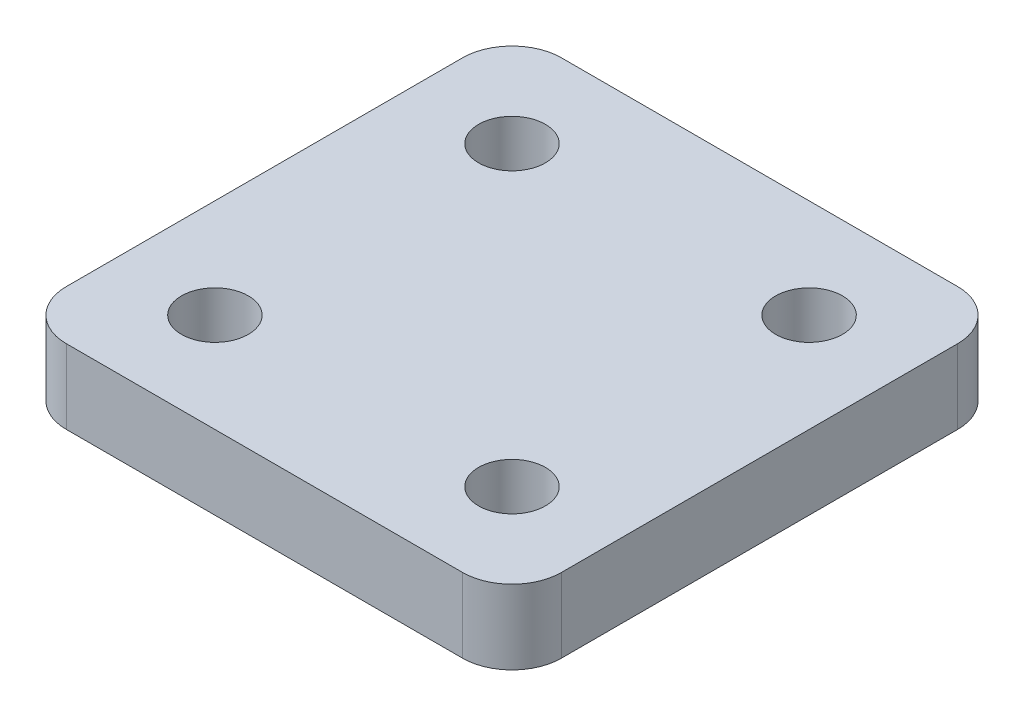
ISO-10303-21;
HEADER;
FILE_DESCRIPTION(('STEP AP214'),'2;1');
FILE_NAME('part.step','',(''),(''),'','','');
FILE_SCHEMA(('AUTOMOTIVE_DESIGN { 1 0 10303 214 1 1 1 1 }'));
ENDSEC;
DATA;
#1=APPLICATION_CONTEXT('core data for automotive mechanical design processes');
#2=APPLICATION_PROTOCOL_DEFINITION('international standard','automotive_design',2000,#1);
#3=PRODUCT_CONTEXT('',#1,'mechanical');
#4=PRODUCT('Part','Part','',(#3));
#5=PRODUCT_RELATED_PRODUCT_CATEGORY('part','',(#4));
#6=PRODUCT_DEFINITION_FORMATION('','',#4);
#7=PRODUCT_DEFINITION_CONTEXT('part definition',#1,'design');
#8=PRODUCT_DEFINITION('design','',#6,#7);
#9=PRODUCT_DEFINITION_SHAPE('','',#8);
#10=(LENGTH_UNIT() NAMED_UNIT(*) SI_UNIT(.MILLI.,.METRE.));
#11=(NAMED_UNIT(*) PLANE_ANGLE_UNIT() SI_UNIT($,.RADIAN.));
#12=(NAMED_UNIT(*) SI_UNIT($,.STERADIAN.) SOLID_ANGLE_UNIT());
#13=UNCERTAINTY_MEASURE_WITH_UNIT(LENGTH_MEASURE(1.E-05),#10,'distance_accuracy_value','');
#14=(GEOMETRIC_REPRESENTATION_CONTEXT(3) GLOBAL_UNCERTAINTY_ASSIGNED_CONTEXT((#13)) GLOBAL_UNIT_ASSIGNED_CONTEXT((#10,
#11,#12)) REPRESENTATION_CONTEXT('',''));
#15=CARTESIAN_POINT('',(0.,0.,0.));
#16=DIRECTION('',(0.,0.,1.));
#17=DIRECTION('',(1.,0.,0.));
#18=AXIS2_PLACEMENT_3D('',#15,#16,#17);
#19=CARTESIAN_POINT('',(0.,3.,0.));
#20=DIRECTION('',(0.,-1.,0.));
#21=DIRECTION('',(0.,0.,-1.));
#22=AXIS2_PLACEMENT_3D('',#19,#20,#21);
#23=PLANE('',#22);
#24=DIRECTION('',(0.,0.,1.));
#25=VECTOR('',#24,1.);
#26=CARTESIAN_POINT('',(-10.,3.,10.));
#27=LINE('',#26,#25);
#28=CARTESIAN_POINT('',(-9.99999999999999,3.,-8.));
#29=VERTEX_POINT('',#28);
#30=CARTESIAN_POINT('',(-10.,3.,8.));
#31=VERTEX_POINT('',#30);
#32=EDGE_CURVE('E214',#29,#31,#27,.T.);
#33=ORIENTED_EDGE('',*,*,#32,.T.);
#34=CARTESIAN_POINT('',(-8.,3.,8.));
#35=DIRECTION('',(0.,-1.,0.));
#36=DIRECTION('',(0.,0.,-1.));
#37=AXIS2_PLACEMENT_3D('',#34,#35,#36);
#38=CIRCLE('',#37,2.);
#39=CARTESIAN_POINT('',(-8.,3.,10.));
#40=VERTEX_POINT('',#39);
#41=EDGE_CURVE('E166',#31,#40,#38,.F.);
#42=ORIENTED_EDGE('',*,*,#41,.T.);
#43=DIRECTION('',(1.,0.,0.));
#44=VECTOR('',#43,1.);
#45=CARTESIAN_POINT('',(-10.,3.,10.));
#46=LINE('',#45,#44);
#47=CARTESIAN_POINT('',(8.00000000000001,3.,10.));
#48=VERTEX_POINT('',#47);
#49=EDGE_CURVE('E125',#40,#48,#46,.T.);
#50=ORIENTED_EDGE('',*,*,#49,.T.);
#51=CARTESIAN_POINT('',(8.,3.,8.));
#52=DIRECTION('',(0.,-1.,0.));
#53=DIRECTION('',(0.,0.,-1.));
#54=AXIS2_PLACEMENT_3D('',#51,#52,#53);
#55=CIRCLE('',#54,2.);
#56=CARTESIAN_POINT('',(10.,3.,8.));
#57=VERTEX_POINT('',#56);
#58=EDGE_CURVE('E161',#48,#57,#55,.F.);
#59=ORIENTED_EDGE('',*,*,#58,.T.);
#60=DIRECTION('',(0.,0.,-1.));
#61=VECTOR('',#60,1.);
#62=CARTESIAN_POINT('',(10.,3.,10.));
#63=LINE('',#62,#61);
#64=CARTESIAN_POINT('',(10.,3.,-8.));
#65=VERTEX_POINT('',#64);
#66=EDGE_CURVE('E133',#57,#65,#63,.T.);
#67=ORIENTED_EDGE('',*,*,#66,.T.);
#68=CARTESIAN_POINT('',(8.,3.,-8.00000000000001));
#69=DIRECTION('',(0.,-1.,0.));
#70=DIRECTION('',(0.,0.,-1.));
#71=AXIS2_PLACEMENT_3D('',#68,#69,#70);
#72=CIRCLE('',#71,2.);
#73=CARTESIAN_POINT('',(8.,3.,-10.));
#74=VERTEX_POINT('',#73);
#75=EDGE_CURVE('E60',#65,#74,#72,.F.);
#76=ORIENTED_EDGE('',*,*,#75,.T.);
#77=DIRECTION('',(-1.,0.,0.));
#78=VECTOR('',#77,1.);
#79=CARTESIAN_POINT('',(-9.99999999999999,3.,-10.));
#80=LINE('',#79,#78);
#81=CARTESIAN_POINT('',(-7.99999999999999,3.,-10.));
#82=VERTEX_POINT('',#81);
#83=EDGE_CURVE('E137',#74,#82,#80,.T.);
#84=ORIENTED_EDGE('',*,*,#83,.T.);
#85=CARTESIAN_POINT('',(-7.99999999999999,3.,-8.));
#86=DIRECTION('',(0.,-1.,0.));
#87=DIRECTION('',(0.,0.,-1.));
#88=AXIS2_PLACEMENT_3D('',#85,#86,#87);
#89=CIRCLE('',#88,2.);
#90=EDGE_CURVE('E164',#82,#29,#89,.F.);
#91=ORIENTED_EDGE('',*,*,#90,.T.);
#92=EDGE_LOOP('',(#33,#42,#50,#59,#67,#76,#84,#91));
#93=FACE_BOUND('',#92,.T.);
#94=CARTESIAN_POINT('',(-6.,3.,-6.));
#95=DIRECTION('',(0.,1.,0.));
#96=DIRECTION('',(0.,0.,1.));
#97=AXIS2_PLACEMENT_3D('',#94,#95,#96);
#98=CIRCLE('',#97,1.35);
#99=CARTESIAN_POINT('',(-6.,3.,-4.65));
#100=VERTEX_POINT('',#99);
#101=EDGE_CURVE('E184',#100,#100,#98,.T.);
#102=ORIENTED_EDGE('',*,*,#101,.F.);
#103=EDGE_LOOP('',(#102));
#104=FACE_BOUND('',#103,.T.);
#105=CARTESIAN_POINT('',(6.,3.,-6.));
#106=DIRECTION('',(0.,1.,0.));
#107=DIRECTION('',(0.,0.,-1.));
#108=AXIS2_PLACEMENT_3D('',#105,#106,#107);
#109=CIRCLE('',#108,1.35);
#110=CARTESIAN_POINT('',(6.,3.,-7.35));
#111=VERTEX_POINT('',#110);
#112=EDGE_CURVE('E220',#111,#111,#109,.T.);
#113=ORIENTED_EDGE('',*,*,#112,.F.);
#114=EDGE_LOOP('',(#113));
#115=FACE_BOUND('',#114,.T.);
#116=CARTESIAN_POINT('',(6.,3.,6.));
#117=DIRECTION('',(0.,1.,0.));
#118=DIRECTION('',(0.,0.,1.));
#119=AXIS2_PLACEMENT_3D('',#116,#117,#118);
#120=CIRCLE('',#119,1.35);
#121=CARTESIAN_POINT('',(6.,3.,7.35));
#122=VERTEX_POINT('',#121);
#123=EDGE_CURVE('E226',#122,#122,#120,.T.);
#124=ORIENTED_EDGE('',*,*,#123,.F.);
#125=EDGE_LOOP('',(#124));
#126=FACE_BOUND('',#125,.T.);
#127=CARTESIAN_POINT('',(-6.,3.,6.));
#128=DIRECTION('',(0.,1.,0.));
#129=DIRECTION('',(0.,0.,-1.));
#130=AXIS2_PLACEMENT_3D('',#127,#128,#129);
#131=CIRCLE('',#130,1.35);
#132=CARTESIAN_POINT('',(-6.,3.,4.65));
#133=VERTEX_POINT('',#132);
#134=EDGE_CURVE('E234',#133,#133,#131,.T.);
#135=ORIENTED_EDGE('',*,*,#134,.F.);
#136=EDGE_LOOP('',(#135));
#137=FACE_BOUND('',#136,.T.);
#138=ADVANCED_FACE('F38',(#93,#104,#115,#126,#137),#23,.F.);
#139=CARTESIAN_POINT('',(0.,0.,0.));
#140=DIRECTION('',(0.,-1.,0.));
#141=DIRECTION('',(0.,0.,-1.));
#142=AXIS2_PLACEMENT_3D('',#139,#140,#141);
#143=PLANE('',#142);
#144=CARTESIAN_POINT('',(6.,0.,6.));
#145=DIRECTION('',(0.,1.,0.));
#146=DIRECTION('',(0.,0.,1.));
#147=AXIS2_PLACEMENT_3D('',#144,#145,#146);
#148=CIRCLE('',#147,1.35);
#149=CARTESIAN_POINT('',(6.,0.,7.35));
#150=VERTEX_POINT('',#149);
#151=EDGE_CURVE('E229',#150,#150,#148,.T.);
#152=ORIENTED_EDGE('',*,*,#151,.T.);
#153=EDGE_LOOP('',(#152));
#154=FACE_BOUND('',#153,.T.);
#155=CARTESIAN_POINT('',(-6.,0.,-6.));
#156=DIRECTION('',(0.,1.,0.));
#157=DIRECTION('',(0.,0.,1.));
#158=AXIS2_PLACEMENT_3D('',#155,#156,#157);
#159=CIRCLE('',#158,1.35);
#160=CARTESIAN_POINT('',(-6.,0.,-4.65));
#161=VERTEX_POINT('',#160);
#162=EDGE_CURVE('E190',#161,#161,#159,.T.);
#163=ORIENTED_EDGE('',*,*,#162,.T.);
#164=EDGE_LOOP('',(#163));
#165=FACE_BOUND('',#164,.T.);
#166=DIRECTION('',(1.,0.,0.));
#167=VECTOR('',#166,1.);
#168=CARTESIAN_POINT('',(-10.,0.,10.));
#169=LINE('',#168,#167);
#170=CARTESIAN_POINT('',(-8.,0.,10.));
#171=VERTEX_POINT('',#170);
#172=CARTESIAN_POINT('',(8.00000000000001,0.,10.));
#173=VERTEX_POINT('',#172);
#174=EDGE_CURVE('E122',#171,#173,#169,.T.);
#175=ORIENTED_EDGE('',*,*,#174,.F.);
#176=CARTESIAN_POINT('',(-8.,0.,8.));
#177=DIRECTION('',(0.,-1.,0.));
#178=DIRECTION('',(0.,0.,-1.));
#179=AXIS2_PLACEMENT_3D('',#176,#177,#178);
#180=CIRCLE('',#179,2.);
#181=CARTESIAN_POINT('',(-10.,0.,8.));
#182=VERTEX_POINT('',#181);
#183=EDGE_CURVE('E104',#171,#182,#180,.T.);
#184=ORIENTED_EDGE('',*,*,#183,.T.);
#185=DIRECTION('',(0.,0.,1.));
#186=VECTOR('',#185,1.);
#187=CARTESIAN_POINT('',(-10.,0.,10.));
#188=LINE('',#187,#186);
#189=CARTESIAN_POINT('',(-9.99999999999999,0.,-8.));
#190=VERTEX_POINT('',#189);
#191=EDGE_CURVE('E134',#190,#182,#188,.T.);
#192=ORIENTED_EDGE('',*,*,#191,.F.);
#193=CARTESIAN_POINT('',(-7.99999999999999,0.,-8.));
#194=DIRECTION('',(0.,-1.,0.));
#195=DIRECTION('',(0.,0.,-1.));
#196=AXIS2_PLACEMENT_3D('',#193,#194,#195);
#197=CIRCLE('',#196,2.);
#198=CARTESIAN_POINT('',(-7.99999999999999,0.,-10.));
#199=VERTEX_POINT('',#198);
#200=EDGE_CURVE('E116',#190,#199,#197,.T.);
#201=ORIENTED_EDGE('',*,*,#200,.T.);
#202=DIRECTION('',(-1.,0.,0.));
#203=VECTOR('',#202,1.);
#204=CARTESIAN_POINT('',(-9.99999999999999,0.,-10.));
#205=LINE('',#204,#203);
#206=CARTESIAN_POINT('',(8.,0.,-10.));
#207=VERTEX_POINT('',#206);
#208=EDGE_CURVE('E140',#207,#199,#205,.T.);
#209=ORIENTED_EDGE('',*,*,#208,.F.);
#210=CARTESIAN_POINT('',(8.,0.,-8.00000000000001));
#211=DIRECTION('',(0.,-1.,0.));
#212=DIRECTION('',(0.,0.,-1.));
#213=AXIS2_PLACEMENT_3D('',#210,#211,#212);
#214=CIRCLE('',#213,2.);
#215=CARTESIAN_POINT('',(10.,0.,-8.));
#216=VERTEX_POINT('',#215);
#217=EDGE_CURVE('E182',#207,#216,#214,.T.);
#218=ORIENTED_EDGE('',*,*,#217,.T.);
#219=DIRECTION('',(0.,0.,-1.));
#220=VECTOR('',#219,1.);
#221=CARTESIAN_POINT('',(10.,0.,10.));
#222=LINE('',#221,#220);
#223=CARTESIAN_POINT('',(10.,0.,8.));
#224=VERTEX_POINT('',#223);
#225=EDGE_CURVE('E177',#224,#216,#222,.T.);
#226=ORIENTED_EDGE('',*,*,#225,.F.);
#227=CARTESIAN_POINT('',(8.,0.,8.));
#228=DIRECTION('',(0.,-1.,0.));
#229=DIRECTION('',(0.,0.,-1.));
#230=AXIS2_PLACEMENT_3D('',#227,#228,#229);
#231=CIRCLE('',#230,2.);
#232=EDGE_CURVE('E126',#224,#173,#231,.T.);
#233=ORIENTED_EDGE('',*,*,#232,.T.);
#234=EDGE_LOOP('',(#175,#184,#192,#201,#209,#218,#226,#233));
#235=FACE_BOUND('',#234,.T.);
#236=CARTESIAN_POINT('',(6.,0.,-6.));
#237=DIRECTION('',(0.,1.,0.));
#238=DIRECTION('',(0.,0.,-1.));
#239=AXIS2_PLACEMENT_3D('',#236,#237,#238);
#240=CIRCLE('',#239,1.35);
#241=CARTESIAN_POINT('',(6.,0.,-7.35));
#242=VERTEX_POINT('',#241);
#243=EDGE_CURVE('E221',#242,#242,#240,.T.);
#244=ORIENTED_EDGE('',*,*,#243,.T.);
#245=EDGE_LOOP('',(#244));
#246=FACE_BOUND('',#245,.T.);
#247=CARTESIAN_POINT('',(-6.,0.,6.));
#248=DIRECTION('',(0.,1.,0.));
#249=DIRECTION('',(0.,0.,-1.));
#250=AXIS2_PLACEMENT_3D('',#247,#248,#249);
#251=CIRCLE('',#250,1.35);
#252=CARTESIAN_POINT('',(-6.,0.,4.65));
#253=VERTEX_POINT('',#252);
#254=EDGE_CURVE('E236',#253,#253,#251,.T.);
#255=ORIENTED_EDGE('',*,*,#254,.T.);
#256=EDGE_LOOP('',(#255));
#257=FACE_BOUND('',#256,.T.);
#258=ADVANCED_FACE('F129',(#154,#165,#235,#246,#257),#143,.T.);
#259=CARTESIAN_POINT('',(10.,3.,10.));
#260=DIRECTION('',(-1.,0.,0.));
#261=DIRECTION('',(0.,0.,1.));
#262=AXIS2_PLACEMENT_3D('',#259,#260,#261);
#263=PLANE('',#262);
#264=ORIENTED_EDGE('',*,*,#225,.T.);
#265=DIRECTION('',(0.,-1.,0.));
#266=VECTOR('',#265,1.);
#267=CARTESIAN_POINT('',(10.,3.,-8.));
#268=LINE('',#267,#266);
#269=EDGE_CURVE('E12',#216,#65,#268,.F.);
#270=ORIENTED_EDGE('',*,*,#269,.T.);
#271=ORIENTED_EDGE('',*,*,#66,.F.);
#272=DIRECTION('',(0.,-1.,0.));
#273=VECTOR('',#272,1.);
#274=CARTESIAN_POINT('',(10.,3.,8.));
#275=LINE('',#274,#273);
#276=EDGE_CURVE('E46',#57,#224,#275,.T.);
#277=ORIENTED_EDGE('',*,*,#276,.T.);
#278=EDGE_LOOP('',(#264,#270,#271,#277));
#279=FACE_BOUND('',#278,.T.);
#280=ADVANCED_FACE('F176',(#279),#263,.F.);
#281=CARTESIAN_POINT('',(-9.99999999999999,3.,-10.));
#282=DIRECTION('',(0.,0.,1.));
#283=DIRECTION('',(1.,0.,0.));
#284=AXIS2_PLACEMENT_3D('',#281,#282,#283);
#285=PLANE('',#284);
#286=ORIENTED_EDGE('',*,*,#208,.T.);
#287=DIRECTION('',(0.,-1.,0.));
#288=VECTOR('',#287,1.);
#289=CARTESIAN_POINT('',(-7.99999999999999,3.,-10.));
#290=LINE('',#289,#288);
#291=EDGE_CURVE('E53',#199,#82,#290,.F.);
#292=ORIENTED_EDGE('',*,*,#291,.T.);
#293=ORIENTED_EDGE('',*,*,#83,.F.);
#294=DIRECTION('',(0.,-1.,0.));
#295=VECTOR('',#294,1.);
#296=CARTESIAN_POINT('',(8.,3.,-10.));
#297=LINE('',#296,#295);
#298=EDGE_CURVE('E168',#74,#207,#297,.T.);
#299=ORIENTED_EDGE('',*,*,#298,.T.);
#300=EDGE_LOOP('',(#286,#292,#293,#299));
#301=FACE_BOUND('',#300,.T.);
#302=ADVANCED_FACE('F207',(#301),#285,.F.);
#303=CARTESIAN_POINT('',(-10.,3.,10.));
#304=DIRECTION('',(1.,0.,0.));
#305=DIRECTION('',(0.,0.,-1.));
#306=AXIS2_PLACEMENT_3D('',#303,#304,#305);
#307=PLANE('',#306);
#308=ORIENTED_EDGE('',*,*,#191,.T.);
#309=DIRECTION('',(0.,-1.,0.));
#310=VECTOR('',#309,1.);
#311=CARTESIAN_POINT('',(-10.,3.,8.));
#312=LINE('',#311,#310);
#313=EDGE_CURVE('E109',#182,#31,#312,.F.);
#314=ORIENTED_EDGE('',*,*,#313,.T.);
#315=ORIENTED_EDGE('',*,*,#32,.F.);
#316=DIRECTION('',(0.,-1.,0.));
#317=VECTOR('',#316,1.);
#318=CARTESIAN_POINT('',(-9.99999999999999,3.,-8.));
#319=LINE('',#318,#317);
#320=EDGE_CURVE('E115',#29,#190,#319,.T.);
#321=ORIENTED_EDGE('',*,*,#320,.T.);
#322=EDGE_LOOP('',(#308,#314,#315,#321));
#323=FACE_BOUND('',#322,.T.);
#324=ADVANCED_FACE('F216',(#323),#307,.F.);
#325=CARTESIAN_POINT('',(-10.,3.,10.));
#326=DIRECTION('',(0.,0.,-1.));
#327=DIRECTION('',(-1.,0.,0.));
#328=AXIS2_PLACEMENT_3D('',#325,#326,#327);
#329=PLANE('',#328);
#330=ORIENTED_EDGE('',*,*,#49,.F.);
#331=DIRECTION('',(0.,-1.,0.));
#332=VECTOR('',#331,1.);
#333=CARTESIAN_POINT('',(-8.,3.,10.));
#334=LINE('',#333,#332);
#335=EDGE_CURVE('E108',#40,#171,#334,.T.);
#336=ORIENTED_EDGE('',*,*,#335,.T.);
#337=ORIENTED_EDGE('',*,*,#174,.T.);
#338=DIRECTION('',(0.,-1.,0.));
#339=VECTOR('',#338,1.);
#340=CARTESIAN_POINT('',(8.00000000000001,3.,10.));
#341=LINE('',#340,#339);
#342=EDGE_CURVE('E127',#173,#48,#341,.F.);
#343=ORIENTED_EDGE('',*,*,#342,.T.);
#344=EDGE_LOOP('',(#330,#336,#337,#343));
#345=FACE_BOUND('',#344,.T.);
#346=ADVANCED_FACE('F121',(#345),#329,.F.);
#347=CARTESIAN_POINT('',(-6.,3.,-6.));
#348=DIRECTION('',(0.,-1.,0.));
#349=DIRECTION('',(0.,0.,-1.));
#350=AXIS2_PLACEMENT_3D('',#347,#348,#349);
#351=CYLINDRICAL_SURFACE('',#350,1.35);
#352=ORIENTED_EDGE('',*,*,#101,.T.);
#353=EDGE_LOOP('',(#352));
#354=FACE_BOUND('',#353,.T.);
#355=ORIENTED_EDGE('',*,*,#162,.F.);
#356=EDGE_LOOP('',(#355));
#357=FACE_BOUND('',#356,.T.);
#358=ADVANCED_FACE('F255',(#354,#357),#351,.F.);
#359=CARTESIAN_POINT('',(6.,3.,-6.));
#360=DIRECTION('',(0.,-1.,0.));
#361=DIRECTION('',(0.,0.,-1.));
#362=AXIS2_PLACEMENT_3D('',#359,#360,#361);
#363=CYLINDRICAL_SURFACE('',#362,1.35);
#364=ORIENTED_EDGE('',*,*,#112,.T.);
#365=EDGE_LOOP('',(#364));
#366=FACE_BOUND('',#365,.T.);
#367=ORIENTED_EDGE('',*,*,#243,.F.);
#368=EDGE_LOOP('',(#367));
#369=FACE_BOUND('',#368,.T.);
#370=ADVANCED_FACE('F347',(#366,#369),#363,.F.);
#371=CARTESIAN_POINT('',(6.,3.,6.));
#372=DIRECTION('',(0.,-1.,0.));
#373=DIRECTION('',(0.,0.,-1.));
#374=AXIS2_PLACEMENT_3D('',#371,#372,#373);
#375=CYLINDRICAL_SURFACE('',#374,1.35);
#376=ORIENTED_EDGE('',*,*,#123,.T.);
#377=EDGE_LOOP('',(#376));
#378=FACE_BOUND('',#377,.T.);
#379=ORIENTED_EDGE('',*,*,#151,.F.);
#380=EDGE_LOOP('',(#379));
#381=FACE_BOUND('',#380,.T.);
#382=ADVANCED_FACE('F338',(#378,#381),#375,.F.);
#383=CARTESIAN_POINT('',(-6.,3.,6.));
#384=DIRECTION('',(0.,-1.,0.));
#385=DIRECTION('',(0.,0.,-1.));
#386=AXIS2_PLACEMENT_3D('',#383,#384,#385);
#387=CYLINDRICAL_SURFACE('',#386,1.35);
#388=ORIENTED_EDGE('',*,*,#134,.T.);
#389=EDGE_LOOP('',(#388));
#390=FACE_BOUND('',#389,.T.);
#391=ORIENTED_EDGE('',*,*,#254,.F.);
#392=EDGE_LOOP('',(#391));
#393=FACE_BOUND('',#392,.T.);
#394=ADVANCED_FACE('F244',(#390,#393),#387,.F.);
#395=CARTESIAN_POINT('',(-8.,3.,8.));
#396=DIRECTION('',(0.,-1.,0.));
#397=DIRECTION('',(0.,0.,-1.));
#398=AXIS2_PLACEMENT_3D('',#395,#396,#397);
#399=CYLINDRICAL_SURFACE('',#398,2.);
#400=ORIENTED_EDGE('',*,*,#41,.F.);
#401=ORIENTED_EDGE('',*,*,#313,.F.);
#402=ORIENTED_EDGE('',*,*,#183,.F.);
#403=ORIENTED_EDGE('',*,*,#335,.F.);
#404=EDGE_LOOP('',(#400,#401,#402,#403));
#405=FACE_BOUND('',#404,.T.);
#406=ADVANCED_FACE('F107',(#405),#399,.T.);
#407=CARTESIAN_POINT('',(-7.99999999999999,3.,-8.));
#408=DIRECTION('',(0.,-1.,0.));
#409=DIRECTION('',(0.,0.,-1.));
#410=AXIS2_PLACEMENT_3D('',#407,#408,#409);
#411=CYLINDRICAL_SURFACE('',#410,2.);
#412=ORIENTED_EDGE('',*,*,#90,.F.);
#413=ORIENTED_EDGE('',*,*,#291,.F.);
#414=ORIENTED_EDGE('',*,*,#200,.F.);
#415=ORIENTED_EDGE('',*,*,#320,.F.);
#416=EDGE_LOOP('',(#412,#413,#414,#415));
#417=FACE_BOUND('',#416,.T.);
#418=ADVANCED_FACE('F210',(#417),#411,.T.);
#419=CARTESIAN_POINT('',(8.,3.,-8.00000000000001));
#420=DIRECTION('',(0.,-1.,0.));
#421=DIRECTION('',(0.,0.,-1.));
#422=AXIS2_PLACEMENT_3D('',#419,#420,#421);
#423=CYLINDRICAL_SURFACE('',#422,2.);
#424=ORIENTED_EDGE('',*,*,#75,.F.);
#425=ORIENTED_EDGE('',*,*,#269,.F.);
#426=ORIENTED_EDGE('',*,*,#217,.F.);
#427=ORIENTED_EDGE('',*,*,#298,.F.);
#428=EDGE_LOOP('',(#424,#425,#426,#427));
#429=FACE_BOUND('',#428,.T.);
#430=ADVANCED_FACE('F269',(#429),#423,.T.);
#431=CARTESIAN_POINT('',(8.,3.,8.));
#432=DIRECTION('',(0.,-1.,0.));
#433=DIRECTION('',(0.,0.,-1.));
#434=AXIS2_PLACEMENT_3D('',#431,#432,#433);
#435=CYLINDRICAL_SURFACE('',#434,2.);
#436=ORIENTED_EDGE('',*,*,#58,.F.);
#437=ORIENTED_EDGE('',*,*,#342,.F.);
#438=ORIENTED_EDGE('',*,*,#232,.F.);
#439=ORIENTED_EDGE('',*,*,#276,.F.);
#440=EDGE_LOOP('',(#436,#437,#438,#439));
#441=FACE_BOUND('',#440,.T.);
#442=ADVANCED_FACE('F40',(#441),#435,.T.);
#443=CLOSED_SHELL('',(#138,#258,#280,#302,#324,#346,#358,#370,#382,#394,#406,#418,#430,#442));
#444=MANIFOLD_SOLID_BREP('B2',#443);
#445=ADVANCED_BREP_SHAPE_REPRESENTATION('',(#18,#444),#14);
#446=SHAPE_DEFINITION_REPRESENTATION(#9,#445);
ENDSEC;
END-ISO-10303-21;
